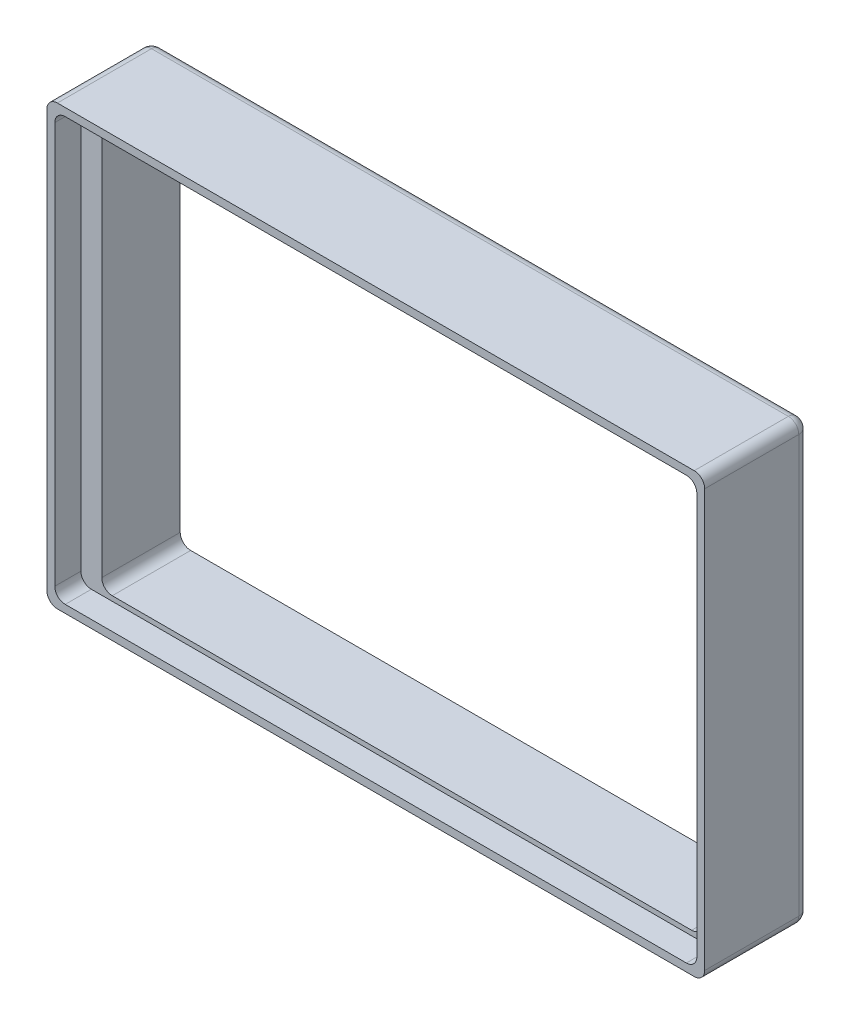
ISO-10303-21;
HEADER;
FILE_DESCRIPTION(('STEP AP214'),'2;1');
FILE_NAME('part.step','',(''),(''),'','','');
FILE_SCHEMA(('AUTOMOTIVE_DESIGN { 1 0 10303 214 1 1 1 1 }'));
ENDSEC;
DATA;
#1=APPLICATION_CONTEXT('core data for automotive mechanical design processes');
#2=APPLICATION_PROTOCOL_DEFINITION('international standard','automotive_design',2000,#1);
#3=PRODUCT_CONTEXT('',#1,'mechanical');
#4=PRODUCT('Part','Part','',(#3));
#5=PRODUCT_RELATED_PRODUCT_CATEGORY('part','',(#4));
#6=PRODUCT_DEFINITION_FORMATION('','',#4);
#7=PRODUCT_DEFINITION_CONTEXT('part definition',#1,'design');
#8=PRODUCT_DEFINITION('design','',#6,#7);
#9=PRODUCT_DEFINITION_SHAPE('','',#8);
#10=(LENGTH_UNIT() NAMED_UNIT(*) SI_UNIT(.MILLI.,.METRE.));
#11=(NAMED_UNIT(*) PLANE_ANGLE_UNIT() SI_UNIT($,.RADIAN.));
#12=(NAMED_UNIT(*) SI_UNIT($,.STERADIAN.) SOLID_ANGLE_UNIT());
#13=UNCERTAINTY_MEASURE_WITH_UNIT(LENGTH_MEASURE(1.E-05),#10,'distance_accuracy_value','');
#14=(GEOMETRIC_REPRESENTATION_CONTEXT(3) GLOBAL_UNCERTAINTY_ASSIGNED_CONTEXT((#13)) GLOBAL_UNIT_ASSIGNED_CONTEXT((#10,
#11,#12)) REPRESENTATION_CONTEXT('',''));
#15=CARTESIAN_POINT('',(0.,0.,0.));
#16=DIRECTION('',(0.,0.,1.));
#17=DIRECTION('',(1.,0.,0.));
#18=AXIS2_PLACEMENT_3D('',#15,#16,#17);
#19=CARTESIAN_POINT('',(0.,0.,15.));
#20=DIRECTION('',(0.,0.,1.));
#21=DIRECTION('',(1.,0.,0.));
#22=AXIS2_PLACEMENT_3D('',#19,#20,#21);
#23=PLANE('',#22);
#24=DIRECTION('',(-1.,0.,0.));
#25=VECTOR('',#24,1.);
#26=CARTESIAN_POINT('',(-61.405,40.4,15.));
#27=LINE('',#26,#25);
#28=CARTESIAN_POINT('',(59.405,40.4,15.));
#29=VERTEX_POINT('',#28);
#30=CARTESIAN_POINT('',(-59.405,40.4,15.));
#31=VERTEX_POINT('',#30);
#32=EDGE_CURVE('E445',#29,#31,#27,.T.);
#33=ORIENTED_EDGE('',*,*,#32,.T.);
#34=CARTESIAN_POINT('',(-59.405,38.4,15.));
#35=DIRECTION('',(0.,0.,1.));
#36=DIRECTION('',(1.,0.,0.));
#37=AXIS2_PLACEMENT_3D('',#34,#35,#36);
#38=CIRCLE('',#37,2.);
#39=CARTESIAN_POINT('',(-61.405,38.4,15.));
#40=VERTEX_POINT('',#39);
#41=EDGE_CURVE('E345',#31,#40,#38,.T.);
#42=ORIENTED_EDGE('',*,*,#41,.T.);
#43=DIRECTION('',(0.,-1.,0.));
#44=VECTOR('',#43,1.);
#45=CARTESIAN_POINT('',(-61.405,40.4,15.));
#46=LINE('',#45,#44);
#47=CARTESIAN_POINT('',(-61.405,-38.4,15.));
#48=VERTEX_POINT('',#47);
#49=EDGE_CURVE('E447',#40,#48,#46,.T.);
#50=ORIENTED_EDGE('',*,*,#49,.T.);
#51=CARTESIAN_POINT('',(-59.405,-38.4,15.));
#52=DIRECTION('',(0.,0.,1.));
#53=DIRECTION('',(1.,0.,0.));
#54=AXIS2_PLACEMENT_3D('',#51,#52,#53);
#55=CIRCLE('',#54,2.);
#56=CARTESIAN_POINT('',(-59.405,-40.4,15.));
#57=VERTEX_POINT('',#56);
#58=EDGE_CURVE('E336',#48,#57,#55,.T.);
#59=ORIENTED_EDGE('',*,*,#58,.T.);
#60=DIRECTION('',(1.,0.,0.));
#61=VECTOR('',#60,1.);
#62=CARTESIAN_POINT('',(-61.405,-40.4,15.));
#63=LINE('',#62,#61);
#64=CARTESIAN_POINT('',(59.405,-40.4,15.));
#65=VERTEX_POINT('',#64);
#66=EDGE_CURVE('E473',#57,#65,#63,.T.);
#67=ORIENTED_EDGE('',*,*,#66,.T.);
#68=CARTESIAN_POINT('',(59.405,-38.4,15.));
#69=DIRECTION('',(0.,0.,1.));
#70=DIRECTION('',(1.,0.,0.));
#71=AXIS2_PLACEMENT_3D('',#68,#69,#70);
#72=CIRCLE('',#71,2.);
#73=CARTESIAN_POINT('',(61.405,-38.4,15.));
#74=VERTEX_POINT('',#73);
#75=EDGE_CURVE('E339',#65,#74,#72,.T.);
#76=ORIENTED_EDGE('',*,*,#75,.T.);
#77=DIRECTION('',(0.,1.,0.));
#78=VECTOR('',#77,1.);
#79=CARTESIAN_POINT('',(61.405,40.4,15.));
#80=LINE('',#79,#78);
#81=CARTESIAN_POINT('',(61.405,38.4,15.));
#82=VERTEX_POINT('',#81);
#83=EDGE_CURVE('E448',#74,#82,#80,.T.);
#84=ORIENTED_EDGE('',*,*,#83,.T.);
#85=CARTESIAN_POINT('',(59.405,38.4,15.));
#86=DIRECTION('',(0.,0.,1.));
#87=DIRECTION('',(1.,0.,0.));
#88=AXIS2_PLACEMENT_3D('',#85,#86,#87);
#89=CIRCLE('',#88,2.);
#90=EDGE_CURVE('E342',#82,#29,#89,.T.);
#91=ORIENTED_EDGE('',*,*,#90,.T.);
#92=EDGE_LOOP('',(#33,#42,#50,#59,#67,#76,#84,#91));
#93=FACE_BOUND('',#92,.T.);
#94=DIRECTION('',(0.,-1.,0.));
#95=VECTOR('',#94,1.);
#96=CARTESIAN_POINT('',(57.41,39.47,15.));
#97=LINE('',#96,#95);
#98=CARTESIAN_POINT('',(57.41,37.47,15.));
#99=VERTEX_POINT('',#98);
#100=CARTESIAN_POINT('',(57.41,-37.47,15.));
#101=VERTEX_POINT('',#100);
#102=EDGE_CURVE('E443',#99,#101,#97,.T.);
#103=ORIENTED_EDGE('',*,*,#102,.T.);
#104=CARTESIAN_POINT('',(55.41,-37.47,15.));
#105=DIRECTION('',(0.,0.,1.));
#106=DIRECTION('',(1.,0.,0.));
#107=AXIS2_PLACEMENT_3D('',#104,#105,#106);
#108=CIRCLE('',#107,2.);
#109=CARTESIAN_POINT('',(55.41,-39.47,15.));
#110=VERTEX_POINT('',#109);
#111=EDGE_CURVE('E411',#101,#110,#108,.F.);
#112=ORIENTED_EDGE('',*,*,#111,.T.);
#113=DIRECTION('',(-1.,0.,0.));
#114=VECTOR('',#113,1.);
#115=CARTESIAN_POINT('',(57.41,-39.47,15.));
#116=LINE('',#115,#114);
#117=CARTESIAN_POINT('',(-55.41,-39.47,15.));
#118=VERTEX_POINT('',#117);
#119=EDGE_CURVE('E425',#110,#118,#116,.T.);
#120=ORIENTED_EDGE('',*,*,#119,.T.);
#121=CARTESIAN_POINT('',(-55.41,-37.47,15.));
#122=DIRECTION('',(0.,0.,1.));
#123=DIRECTION('',(1.,0.,0.));
#124=AXIS2_PLACEMENT_3D('',#121,#122,#123);
#125=CIRCLE('',#124,2.);
#126=CARTESIAN_POINT('',(-57.41,-37.47,15.));
#127=VERTEX_POINT('',#126);
#128=EDGE_CURVE('E11',#118,#127,#125,.F.);
#129=ORIENTED_EDGE('',*,*,#128,.T.);
#130=DIRECTION('',(0.,1.,0.));
#131=VECTOR('',#130,1.);
#132=CARTESIAN_POINT('',(-57.41,39.47,15.));
#133=LINE('',#132,#131);
#134=CARTESIAN_POINT('',(-57.41,37.47,15.));
#135=VERTEX_POINT('',#134);
#136=EDGE_CURVE('E459',#127,#135,#133,.T.);
#137=ORIENTED_EDGE('',*,*,#136,.T.);
#138=CARTESIAN_POINT('',(-55.41,37.47,15.));
#139=DIRECTION('',(0.,0.,1.));
#140=DIRECTION('',(1.,0.,0.));
#141=AXIS2_PLACEMENT_3D('',#138,#139,#140);
#142=CIRCLE('',#141,2.);
#143=CARTESIAN_POINT('',(-55.41,39.47,15.));
#144=VERTEX_POINT('',#143);
#145=EDGE_CURVE('E394',#135,#144,#142,.F.);
#146=ORIENTED_EDGE('',*,*,#145,.T.);
#147=DIRECTION('',(1.,0.,0.));
#148=VECTOR('',#147,1.);
#149=CARTESIAN_POINT('',(57.41,39.47,15.));
#150=LINE('',#149,#148);
#151=CARTESIAN_POINT('',(55.41,39.47,15.));
#152=VERTEX_POINT('',#151);
#153=EDGE_CURVE('E462',#144,#152,#150,.T.);
#154=ORIENTED_EDGE('',*,*,#153,.T.);
#155=CARTESIAN_POINT('',(55.41,37.47,15.));
#156=DIRECTION('',(0.,0.,1.));
#157=DIRECTION('',(1.,0.,0.));
#158=AXIS2_PLACEMENT_3D('',#155,#156,#157);
#159=CIRCLE('',#158,2.);
#160=EDGE_CURVE('E400',#152,#99,#159,.F.);
#161=ORIENTED_EDGE('',*,*,#160,.T.);
#162=EDGE_LOOP('',(#103,#112,#120,#129,#137,#146,#154,#161));
#163=FACE_BOUND('',#162,.T.);
#164=ADVANCED_FACE('F45',(#93,#163),#23,.T.);
#165=CARTESIAN_POINT('',(62.905,41.9,20.));
#166=DIRECTION('',(-1.,0.,0.));
#167=DIRECTION('',(0.,0.,1.));
#168=AXIS2_PLACEMENT_3D('',#165,#166,#167);
#169=PLANE('',#168);
#170=DIRECTION('',(0.,1.,0.));
#171=VECTOR('',#170,1.);
#172=CARTESIAN_POINT('',(62.905,41.9,2.));
#173=LINE('',#172,#171);
#174=CARTESIAN_POINT('',(62.905,-39.9,2.));
#175=VERTEX_POINT('',#174);
#176=CARTESIAN_POINT('',(62.905,39.9,2.));
#177=VERTEX_POINT('',#176);
#178=EDGE_CURVE('E235',#175,#177,#173,.T.);
#179=ORIENTED_EDGE('',*,*,#178,.T.);
#180=DIRECTION('',(0.,0.,-1.));
#181=VECTOR('',#180,1.);
#182=CARTESIAN_POINT('',(62.905,39.9,20.));
#183=LINE('',#182,#181);
#184=CARTESIAN_POINT('',(62.905,39.9,20.));
#185=VERTEX_POINT('',#184);
#186=EDGE_CURVE('E282',#177,#185,#183,.F.);
#187=ORIENTED_EDGE('',*,*,#186,.T.);
#188=DIRECTION('',(0.,1.,0.));
#189=VECTOR('',#188,1.);
#190=CARTESIAN_POINT('',(62.905,41.9,20.));
#191=LINE('',#190,#189);
#192=CARTESIAN_POINT('',(62.905,-39.9,20.));
#193=VERTEX_POINT('',#192);
#194=EDGE_CURVE('E439',#193,#185,#191,.T.);
#195=ORIENTED_EDGE('',*,*,#194,.F.);
#196=DIRECTION('',(0.,0.,-1.));
#197=VECTOR('',#196,1.);
#198=CARTESIAN_POINT('',(62.905,-39.9,20.));
#199=LINE('',#198,#197);
#200=EDGE_CURVE('E279',#193,#175,#199,.T.);
#201=ORIENTED_EDGE('',*,*,#200,.T.);
#202=EDGE_LOOP('',(#179,#187,#195,#201));
#203=FACE_BOUND('',#202,.T.);
#204=ADVANCED_FACE('F584',(#203),#169,.F.);
#205=CARTESIAN_POINT('',(-62.905,41.9,20.));
#206=DIRECTION('',(0.,-1.,0.));
#207=DIRECTION('',(0.,0.,-1.));
#208=AXIS2_PLACEMENT_3D('',#205,#206,#207);
#209=PLANE('',#208);
#210=DIRECTION('',(-1.,0.,0.));
#211=VECTOR('',#210,1.);
#212=CARTESIAN_POINT('',(-62.905,41.9,20.));
#213=LINE('',#212,#211);
#214=CARTESIAN_POINT('',(60.905,41.9,20.));
#215=VERTEX_POINT('',#214);
#216=CARTESIAN_POINT('',(-60.905,41.9,20.));
#217=VERTEX_POINT('',#216);
#218=EDGE_CURVE('E435',#215,#217,#213,.T.);
#219=ORIENTED_EDGE('',*,*,#218,.F.);
#220=DIRECTION('',(0.,0.,-1.));
#221=VECTOR('',#220,1.);
#222=CARTESIAN_POINT('',(60.905,41.9,20.));
#223=LINE('',#222,#221);
#224=CARTESIAN_POINT('',(60.905,41.9,2.));
#225=VERTEX_POINT('',#224);
#226=EDGE_CURVE('E276',#215,#225,#223,.T.);
#227=ORIENTED_EDGE('',*,*,#226,.T.);
#228=DIRECTION('',(-1.,0.,0.));
#229=VECTOR('',#228,1.);
#230=CARTESIAN_POINT('',(-62.905,41.9,2.));
#231=LINE('',#230,#229);
#232=CARTESIAN_POINT('',(-60.905,41.9,2.));
#233=VERTEX_POINT('',#232);
#234=EDGE_CURVE('E228',#225,#233,#231,.T.);
#235=ORIENTED_EDGE('',*,*,#234,.T.);
#236=DIRECTION('',(0.,0.,-1.));
#237=VECTOR('',#236,1.);
#238=CARTESIAN_POINT('',(-60.905,41.9,20.));
#239=LINE('',#238,#237);
#240=EDGE_CURVE('E267',#233,#217,#239,.F.);
#241=ORIENTED_EDGE('',*,*,#240,.T.);
#242=EDGE_LOOP('',(#219,#227,#235,#241));
#243=FACE_BOUND('',#242,.T.);
#244=ADVANCED_FACE('F522',(#243),#209,.F.);
#245=CARTESIAN_POINT('',(-62.905,41.9,20.));
#246=DIRECTION('',(1.,0.,0.));
#247=DIRECTION('',(0.,0.,-1.));
#248=AXIS2_PLACEMENT_3D('',#245,#246,#247);
#249=PLANE('',#248);
#250=DIRECTION('',(0.,-1.,0.));
#251=VECTOR('',#250,1.);
#252=CARTESIAN_POINT('',(-62.905,41.9,20.));
#253=LINE('',#252,#251);
#254=CARTESIAN_POINT('',(-62.905,39.9,20.));
#255=VERTEX_POINT('',#254);
#256=CARTESIAN_POINT('',(-62.905,-39.9,20.));
#257=VERTEX_POINT('',#256);
#258=EDGE_CURVE('E431',#255,#257,#253,.T.);
#259=ORIENTED_EDGE('',*,*,#258,.F.);
#260=DIRECTION('',(0.,0.,-1.));
#261=VECTOR('',#260,1.);
#262=CARTESIAN_POINT('',(-62.905,39.9,20.));
#263=LINE('',#262,#261);
#264=CARTESIAN_POINT('',(-62.905,39.9,2.));
#265=VERTEX_POINT('',#264);
#266=EDGE_CURVE('E300',#255,#265,#263,.T.);
#267=ORIENTED_EDGE('',*,*,#266,.T.);
#268=DIRECTION('',(0.,-1.,0.));
#269=VECTOR('',#268,1.);
#270=CARTESIAN_POINT('',(-62.905,41.9,2.));
#271=LINE('',#270,#269);
#272=CARTESIAN_POINT('',(-62.905,-39.9,2.));
#273=VERTEX_POINT('',#272);
#274=EDGE_CURVE('E258',#265,#273,#271,.T.);
#275=ORIENTED_EDGE('',*,*,#274,.T.);
#276=DIRECTION('',(0.,0.,-1.));
#277=VECTOR('',#276,1.);
#278=CARTESIAN_POINT('',(-62.905,-39.9,20.));
#279=LINE('',#278,#277);
#280=EDGE_CURVE('E297',#273,#257,#279,.F.);
#281=ORIENTED_EDGE('',*,*,#280,.T.);
#282=EDGE_LOOP('',(#259,#267,#275,#281));
#283=FACE_BOUND('',#282,.T.);
#284=ADVANCED_FACE('F510',(#283),#249,.F.);
#285=CARTESIAN_POINT('',(-62.905,-41.9,20.));
#286=DIRECTION('',(0.,1.,0.));
#287=DIRECTION('',(0.,0.,1.));
#288=AXIS2_PLACEMENT_3D('',#285,#286,#287);
#289=PLANE('',#288);
#290=DIRECTION('',(1.,0.,0.));
#291=VECTOR('',#290,1.);
#292=CARTESIAN_POINT('',(-62.905,-41.9,20.));
#293=LINE('',#292,#291);
#294=CARTESIAN_POINT('',(-60.905,-41.9,20.));
#295=VERTEX_POINT('',#294);
#296=CARTESIAN_POINT('',(60.905,-41.9,20.));
#297=VERTEX_POINT('',#296);
#298=EDGE_CURVE('E434',#295,#297,#293,.T.);
#299=ORIENTED_EDGE('',*,*,#298,.F.);
#300=DIRECTION('',(0.,0.,-1.));
#301=VECTOR('',#300,1.);
#302=CARTESIAN_POINT('',(-60.905,-41.9,20.));
#303=LINE('',#302,#301);
#304=CARTESIAN_POINT('',(-60.905,-41.9,2.));
#305=VERTEX_POINT('',#304);
#306=EDGE_CURVE('E306',#295,#305,#303,.T.);
#307=ORIENTED_EDGE('',*,*,#306,.T.);
#308=DIRECTION('',(1.,0.,0.));
#309=VECTOR('',#308,1.);
#310=CARTESIAN_POINT('',(-62.905,-41.9,2.));
#311=LINE('',#310,#309);
#312=CARTESIAN_POINT('',(60.905,-41.9,2.));
#313=VERTEX_POINT('',#312);
#314=EDGE_CURVE('E485',#305,#313,#311,.T.);
#315=ORIENTED_EDGE('',*,*,#314,.T.);
#316=DIRECTION('',(0.,0.,-1.));
#317=VECTOR('',#316,1.);
#318=CARTESIAN_POINT('',(60.905,-41.9,20.));
#319=LINE('',#318,#317);
#320=EDGE_CURVE('E303',#313,#297,#319,.F.);
#321=ORIENTED_EDGE('',*,*,#320,.T.);
#322=EDGE_LOOP('',(#299,#307,#315,#321));
#323=FACE_BOUND('',#322,.T.);
#324=ADVANCED_FACE('F612',(#323),#289,.F.);
#325=CARTESIAN_POINT('',(0.,0.,20.));
#326=DIRECTION('',(0.,0.,1.));
#327=DIRECTION('',(1.,0.,0.));
#328=AXIS2_PLACEMENT_3D('',#325,#326,#327);
#329=PLANE('',#328);
#330=DIRECTION('',(0.,1.,0.));
#331=VECTOR('',#330,1.);
#332=CARTESIAN_POINT('',(61.405,40.4,20.));
#333=LINE('',#332,#331);
#334=CARTESIAN_POINT('',(61.405,-38.4,20.));
#335=VERTEX_POINT('',#334);
#336=CARTESIAN_POINT('',(61.405,38.4,20.));
#337=VERTEX_POINT('',#336);
#338=EDGE_CURVE('E422',#335,#337,#333,.T.);
#339=ORIENTED_EDGE('',*,*,#338,.F.);
#340=CARTESIAN_POINT('',(59.405,-38.4,20.));
#341=DIRECTION('',(0.,0.,1.));
#342=DIRECTION('',(1.,0.,0.));
#343=AXIS2_PLACEMENT_3D('',#340,#341,#342);
#344=CIRCLE('',#343,2.);
#345=CARTESIAN_POINT('',(59.405,-40.4,20.));
#346=VERTEX_POINT('',#345);
#347=EDGE_CURVE('E406',#335,#346,#344,.F.);
#348=ORIENTED_EDGE('',*,*,#347,.T.);
#349=DIRECTION('',(1.,0.,0.));
#350=VECTOR('',#349,1.);
#351=CARTESIAN_POINT('',(-61.405,-40.4,20.));
#352=LINE('',#351,#350);
#353=CARTESIAN_POINT('',(-59.405,-40.4,20.));
#354=VERTEX_POINT('',#353);
#355=EDGE_CURVE('E468',#354,#346,#352,.T.);
#356=ORIENTED_EDGE('',*,*,#355,.F.);
#357=CARTESIAN_POINT('',(-59.405,-38.4,20.));
#358=DIRECTION('',(0.,0.,1.));
#359=DIRECTION('',(1.,0.,0.));
#360=AXIS2_PLACEMENT_3D('',#357,#358,#359);
#361=CIRCLE('',#360,2.);
#362=CARTESIAN_POINT('',(-61.405,-38.4,20.));
#363=VERTEX_POINT('',#362);
#364=EDGE_CURVE('E414',#354,#363,#361,.F.);
#365=ORIENTED_EDGE('',*,*,#364,.T.);
#366=DIRECTION('',(0.,-1.,0.));
#367=VECTOR('',#366,1.);
#368=CARTESIAN_POINT('',(-61.405,40.4,20.));
#369=LINE('',#368,#367);
#370=CARTESIAN_POINT('',(-61.405,38.4,20.));
#371=VERTEX_POINT('',#370);
#372=EDGE_CURVE('E465',#371,#363,#369,.T.);
#373=ORIENTED_EDGE('',*,*,#372,.F.);
#374=CARTESIAN_POINT('',(-59.405,38.4,20.));
#375=DIRECTION('',(0.,0.,1.));
#376=DIRECTION('',(1.,0.,0.));
#377=AXIS2_PLACEMENT_3D('',#374,#375,#376);
#378=CIRCLE('',#377,2.);
#379=CARTESIAN_POINT('',(-59.405,40.4,20.));
#380=VERTEX_POINT('',#379);
#381=EDGE_CURVE('E388',#371,#380,#378,.F.);
#382=ORIENTED_EDGE('',*,*,#381,.T.);
#383=DIRECTION('',(-1.,0.,0.));
#384=VECTOR('',#383,1.);
#385=CARTESIAN_POINT('',(-61.405,40.4,20.));
#386=LINE('',#385,#384);
#387=CARTESIAN_POINT('',(59.405,40.4,20.));
#388=VERTEX_POINT('',#387);
#389=EDGE_CURVE('E424',#388,#380,#386,.T.);
#390=ORIENTED_EDGE('',*,*,#389,.F.);
#391=CARTESIAN_POINT('',(59.405,38.4,20.));
#392=DIRECTION('',(0.,0.,1.));
#393=DIRECTION('',(1.,0.,0.));
#394=AXIS2_PLACEMENT_3D('',#391,#392,#393);
#395=CIRCLE('',#394,2.);
#396=EDGE_CURVE('E403',#388,#337,#395,.F.);
#397=ORIENTED_EDGE('',*,*,#396,.T.);
#398=EDGE_LOOP('',(#339,#348,#356,#365,#373,#382,#390,#397));
#399=FACE_BOUND('',#398,.T.);
#400=ORIENTED_EDGE('',*,*,#194,.T.);
#401=CARTESIAN_POINT('',(60.905,39.9,20.));
#402=DIRECTION('',(0.,0.,1.));
#403=DIRECTION('',(1.,0.,0.));
#404=AXIS2_PLACEMENT_3D('',#401,#402,#403);
#405=CIRCLE('',#404,2.);
#406=EDGE_CURVE('E294',#185,#215,#405,.T.);
#407=ORIENTED_EDGE('',*,*,#406,.T.);
#408=ORIENTED_EDGE('',*,*,#218,.T.);
#409=CARTESIAN_POINT('',(-60.905,39.9,20.));
#410=DIRECTION('',(0.,0.,1.));
#411=DIRECTION('',(1.,0.,0.));
#412=AXIS2_PLACEMENT_3D('',#409,#410,#411);
#413=CIRCLE('',#412,2.);
#414=EDGE_CURVE('E291',#217,#255,#413,.T.);
#415=ORIENTED_EDGE('',*,*,#414,.T.);
#416=ORIENTED_EDGE('',*,*,#258,.T.);
#417=CARTESIAN_POINT('',(-60.905,-39.9,20.));
#418=DIRECTION('',(0.,0.,1.));
#419=DIRECTION('',(1.,0.,0.));
#420=AXIS2_PLACEMENT_3D('',#417,#418,#419);
#421=CIRCLE('',#420,2.);
#422=EDGE_CURVE('E288',#257,#295,#421,.T.);
#423=ORIENTED_EDGE('',*,*,#422,.T.);
#424=ORIENTED_EDGE('',*,*,#298,.T.);
#425=CARTESIAN_POINT('',(60.905,-39.9,20.));
#426=DIRECTION('',(0.,0.,1.));
#427=DIRECTION('',(1.,0.,0.));
#428=AXIS2_PLACEMENT_3D('',#425,#426,#427);
#429=CIRCLE('',#428,2.);
#430=EDGE_CURVE('E285',#297,#193,#429,.T.);
#431=ORIENTED_EDGE('',*,*,#430,.T.);
#432=EDGE_LOOP('',(#400,#407,#408,#415,#416,#423,#424,#431));
#433=FACE_BOUND('',#432,.T.);
#434=ADVANCED_FACE('F609',(#399,#433),#329,.T.);
#435=CARTESIAN_POINT('',(0.,0.,0.));
#436=DIRECTION('',(0.,0.,1.));
#437=DIRECTION('',(1.,0.,0.));
#438=AXIS2_PLACEMENT_3D('',#435,#436,#437);
#439=PLANE('',#438);
#440=DIRECTION('',(0.,-1.,0.));
#441=VECTOR('',#440,1.);
#442=CARTESIAN_POINT('',(-60.905,0.,0.));
#443=LINE('',#442,#441);
#444=CARTESIAN_POINT('',(-60.905,-39.9,0.));
#445=VERTEX_POINT('',#444);
#446=CARTESIAN_POINT('',(-60.905,39.9,0.));
#447=VERTEX_POINT('',#446);
#448=EDGE_CURVE('E256',#445,#447,#443,.F.);
#449=ORIENTED_EDGE('',*,*,#448,.T.);
#450=DIRECTION('',(-1.,0.,0.));
#451=VECTOR('',#450,1.);
#452=CARTESIAN_POINT('',(0.,39.9,0.));
#453=LINE('',#452,#451);
#454=CARTESIAN_POINT('',(60.905,39.9,0.));
#455=VERTEX_POINT('',#454);
#456=EDGE_CURVE('E225',#447,#455,#453,.F.);
#457=ORIENTED_EDGE('',*,*,#456,.T.);
#458=DIRECTION('',(0.,1.,0.));
#459=VECTOR('',#458,1.);
#460=CARTESIAN_POINT('',(60.905,0.,0.));
#461=LINE('',#460,#459);
#462=CARTESIAN_POINT('',(60.905,-39.9,0.));
#463=VERTEX_POINT('',#462);
#464=EDGE_CURVE('E240',#455,#463,#461,.F.);
#465=ORIENTED_EDGE('',*,*,#464,.T.);
#466=DIRECTION('',(1.,0.,0.));
#467=VECTOR('',#466,1.);
#468=CARTESIAN_POINT('',(0.,-39.9,0.));
#469=LINE('',#468,#467);
#470=EDGE_CURVE('E251',#463,#445,#469,.F.);
#471=ORIENTED_EDGE('',*,*,#470,.T.);
#472=EDGE_LOOP('',(#449,#457,#465,#471));
#473=FACE_BOUND('',#472,.T.);
#474=DIRECTION('',(1.,0.,0.));
#475=VECTOR('',#474,1.);
#476=CARTESIAN_POINT('',(57.41,39.47,0.));
#477=LINE('',#476,#475);
#478=CARTESIAN_POINT('',(-55.41,39.47,0.));
#479=VERTEX_POINT('',#478);
#480=CARTESIAN_POINT('',(55.41,39.47,0.));
#481=VERTEX_POINT('',#480);
#482=EDGE_CURVE('E451',#479,#481,#477,.T.);
#483=ORIENTED_EDGE('',*,*,#482,.F.);
#484=CARTESIAN_POINT('',(-55.41,37.47,0.));
#485=DIRECTION('',(0.,0.,1.));
#486=DIRECTION('',(1.,0.,0.));
#487=AXIS2_PLACEMENT_3D('',#484,#485,#486);
#488=CIRCLE('',#487,2.);
#489=CARTESIAN_POINT('',(-57.41,37.47,0.));
#490=VERTEX_POINT('',#489);
#491=EDGE_CURVE('E391',#479,#490,#488,.T.);
#492=ORIENTED_EDGE('',*,*,#491,.T.);
#493=DIRECTION('',(0.,1.,0.));
#494=VECTOR('',#493,1.);
#495=CARTESIAN_POINT('',(-57.41,39.47,0.));
#496=LINE('',#495,#494);
#497=CARTESIAN_POINT('',(-57.41,-37.47,0.));
#498=VERTEX_POINT('',#497);
#499=EDGE_CURVE('E313',#498,#490,#496,.T.);
#500=ORIENTED_EDGE('',*,*,#499,.F.);
#501=CARTESIAN_POINT('',(-55.41,-37.47,0.));
#502=DIRECTION('',(0.,0.,1.));
#503=DIRECTION('',(1.,0.,0.));
#504=AXIS2_PLACEMENT_3D('',#501,#502,#503);
#505=CIRCLE('',#504,2.);
#506=CARTESIAN_POINT('',(-55.41,-39.47,0.));
#507=VERTEX_POINT('',#506);
#508=EDGE_CURVE('E54',#498,#507,#505,.T.);
#509=ORIENTED_EDGE('',*,*,#508,.T.);
#510=DIRECTION('',(-1.,0.,0.));
#511=VECTOR('',#510,1.);
#512=CARTESIAN_POINT('',(57.41,-39.47,0.));
#513=LINE('',#512,#511);
#514=CARTESIAN_POINT('',(55.41,-39.47,0.));
#515=VERTEX_POINT('',#514);
#516=EDGE_CURVE('E463',#515,#507,#513,.T.);
#517=ORIENTED_EDGE('',*,*,#516,.F.);
#518=CARTESIAN_POINT('',(55.41,-37.47,0.));
#519=DIRECTION('',(0.,0.,1.));
#520=DIRECTION('',(1.,0.,0.));
#521=AXIS2_PLACEMENT_3D('',#518,#519,#520);
#522=CIRCLE('',#521,2.);
#523=CARTESIAN_POINT('',(57.41,-37.47,0.));
#524=VERTEX_POINT('',#523);
#525=EDGE_CURVE('E68',#515,#524,#522,.T.);
#526=ORIENTED_EDGE('',*,*,#525,.T.);
#527=DIRECTION('',(0.,-1.,0.));
#528=VECTOR('',#527,1.);
#529=CARTESIAN_POINT('',(57.41,39.47,0.));
#530=LINE('',#529,#528);
#531=CARTESIAN_POINT('',(57.41,37.47,0.));
#532=VERTEX_POINT('',#531);
#533=EDGE_CURVE('E453',#532,#524,#530,.T.);
#534=ORIENTED_EDGE('',*,*,#533,.F.);
#535=CARTESIAN_POINT('',(55.41,37.47,0.));
#536=DIRECTION('',(0.,0.,1.));
#537=DIRECTION('',(1.,0.,0.));
#538=AXIS2_PLACEMENT_3D('',#535,#536,#537);
#539=CIRCLE('',#538,2.);
#540=EDGE_CURVE('E397',#532,#481,#539,.T.);
#541=ORIENTED_EDGE('',*,*,#540,.T.);
#542=EDGE_LOOP('',(#483,#492,#500,#509,#517,#526,#534,#541));
#543=FACE_BOUND('',#542,.T.);
#544=ADVANCED_FACE('F254',(#473,#543),#439,.F.);
#545=CARTESIAN_POINT('',(61.405,40.4,15.));
#546=DIRECTION('',(1.,0.,0.));
#547=DIRECTION('',(0.,0.,-1.));
#548=AXIS2_PLACEMENT_3D('',#545,#546,#547);
#549=PLANE('',#548);
#550=ORIENTED_EDGE('',*,*,#338,.T.);
#551=DIRECTION('',(0.,0.,1.));
#552=VECTOR('',#551,1.);
#553=CARTESIAN_POINT('',(61.405,38.4,15.));
#554=LINE('',#553,#552);
#555=EDGE_CURVE('E372',#337,#82,#554,.F.);
#556=ORIENTED_EDGE('',*,*,#555,.T.);
#557=ORIENTED_EDGE('',*,*,#83,.F.);
#558=DIRECTION('',(0.,0.,1.));
#559=VECTOR('',#558,1.);
#560=CARTESIAN_POINT('',(61.405,-38.4,20.));
#561=LINE('',#560,#559);
#562=EDGE_CURVE('E368',#74,#335,#561,.T.);
#563=ORIENTED_EDGE('',*,*,#562,.T.);
#564=EDGE_LOOP('',(#550,#556,#557,#563));
#565=FACE_BOUND('',#564,.T.);
#566=ADVANCED_FACE('F597',(#565),#549,.F.);
#567=CARTESIAN_POINT('',(-61.405,-40.4,15.));
#568=DIRECTION('',(0.,-1.,0.));
#569=DIRECTION('',(0.,0.,-1.));
#570=AXIS2_PLACEMENT_3D('',#567,#568,#569);
#571=PLANE('',#570);
#572=ORIENTED_EDGE('',*,*,#355,.T.);
#573=DIRECTION('',(0.,0.,1.));
#574=VECTOR('',#573,1.);
#575=CARTESIAN_POINT('',(59.405,-40.4,15.));
#576=LINE('',#575,#574);
#577=EDGE_CURVE('E379',#346,#65,#576,.F.);
#578=ORIENTED_EDGE('',*,*,#577,.T.);
#579=ORIENTED_EDGE('',*,*,#66,.F.);
#580=DIRECTION('',(0.,0.,1.));
#581=VECTOR('',#580,1.);
#582=CARTESIAN_POINT('',(-59.405,-40.4,20.));
#583=LINE('',#582,#581);
#584=EDGE_CURVE('E375',#57,#354,#583,.T.);
#585=ORIENTED_EDGE('',*,*,#584,.T.);
#586=EDGE_LOOP('',(#572,#578,#579,#585));
#587=FACE_BOUND('',#586,.T.);
#588=ADVANCED_FACE('F593',(#587),#571,.F.);
#589=CARTESIAN_POINT('',(-61.405,40.4,15.));
#590=DIRECTION('',(-1.,0.,0.));
#591=DIRECTION('',(0.,0.,1.));
#592=AXIS2_PLACEMENT_3D('',#589,#590,#591);
#593=PLANE('',#592);
#594=ORIENTED_EDGE('',*,*,#49,.F.);
#595=DIRECTION('',(0.,0.,1.));
#596=VECTOR('',#595,1.);
#597=CARTESIAN_POINT('',(-61.405,38.4,20.));
#598=LINE('',#597,#596);
#599=EDGE_CURVE('E325',#40,#371,#598,.T.);
#600=ORIENTED_EDGE('',*,*,#599,.T.);
#601=ORIENTED_EDGE('',*,*,#372,.T.);
#602=DIRECTION('',(0.,0.,1.));
#603=VECTOR('',#602,1.);
#604=CARTESIAN_POINT('',(-61.405,-38.4,15.));
#605=LINE('',#604,#603);
#606=EDGE_CURVE('E309',#363,#48,#605,.F.);
#607=ORIENTED_EDGE('',*,*,#606,.T.);
#608=EDGE_LOOP('',(#594,#600,#601,#607));
#609=FACE_BOUND('',#608,.T.);
#610=ADVANCED_FACE('F596',(#609),#593,.F.);
#611=CARTESIAN_POINT('',(-61.405,40.4,15.));
#612=DIRECTION('',(0.,1.,0.));
#613=DIRECTION('',(0.,0.,1.));
#614=AXIS2_PLACEMENT_3D('',#611,#612,#613);
#615=PLANE('',#614);
#616=ORIENTED_EDGE('',*,*,#389,.T.);
#617=DIRECTION('',(0.,0.,1.));
#618=VECTOR('',#617,1.);
#619=CARTESIAN_POINT('',(-59.405,40.4,15.));
#620=LINE('',#619,#618);
#621=EDGE_CURVE('E333',#380,#31,#620,.F.);
#622=ORIENTED_EDGE('',*,*,#621,.T.);
#623=ORIENTED_EDGE('',*,*,#32,.F.);
#624=DIRECTION('',(0.,0.,1.));
#625=VECTOR('',#624,1.);
#626=CARTESIAN_POINT('',(59.405,40.4,20.));
#627=LINE('',#626,#625);
#628=EDGE_CURVE('E329',#29,#388,#627,.T.);
#629=ORIENTED_EDGE('',*,*,#628,.T.);
#630=EDGE_LOOP('',(#616,#622,#623,#629));
#631=FACE_BOUND('',#630,.T.);
#632=ADVANCED_FACE('F601',(#631),#615,.F.);
#633=CARTESIAN_POINT('',(-57.41,39.47,15.));
#634=DIRECTION('',(-1.,0.,0.));
#635=DIRECTION('',(0.,0.,1.));
#636=AXIS2_PLACEMENT_3D('',#633,#634,#635);
#637=PLANE('',#636);
#638=ORIENTED_EDGE('',*,*,#499,.T.);
#639=DIRECTION('',(0.,0.,-1.));
#640=VECTOR('',#639,1.);
#641=CARTESIAN_POINT('',(-57.41,37.47,15.));
#642=LINE('',#641,#640);
#643=EDGE_CURVE('E359',#490,#135,#642,.F.);
#644=ORIENTED_EDGE('',*,*,#643,.T.);
#645=ORIENTED_EDGE('',*,*,#136,.F.);
#646=DIRECTION('',(0.,0.,-1.));
#647=VECTOR('',#646,1.);
#648=CARTESIAN_POINT('',(-57.41,-37.47,0.));
#649=LINE('',#648,#647);
#650=EDGE_CURVE('E355',#127,#498,#649,.T.);
#651=ORIENTED_EDGE('',*,*,#650,.T.);
#652=EDGE_LOOP('',(#638,#644,#645,#651));
#653=FACE_BOUND('',#652,.T.);
#654=ADVANCED_FACE('F567',(#653),#637,.F.);
#655=CARTESIAN_POINT('',(57.41,-39.47,15.));
#656=DIRECTION('',(0.,-1.,0.));
#657=DIRECTION('',(0.,0.,-1.));
#658=AXIS2_PLACEMENT_3D('',#655,#656,#657);
#659=PLANE('',#658);
#660=ORIENTED_EDGE('',*,*,#119,.F.);
#661=DIRECTION('',(0.,0.,-1.));
#662=VECTOR('',#661,1.);
#663=CARTESIAN_POINT('',(55.41,-39.47,0.));
#664=LINE('',#663,#662);
#665=EDGE_CURVE('E385',#110,#515,#664,.T.);
#666=ORIENTED_EDGE('',*,*,#665,.T.);
#667=ORIENTED_EDGE('',*,*,#516,.T.);
#668=DIRECTION('',(0.,0.,-1.));
#669=VECTOR('',#668,1.);
#670=CARTESIAN_POINT('',(-55.41,-39.47,15.));
#671=LINE('',#670,#669);
#672=EDGE_CURVE('E382',#507,#118,#671,.F.);
#673=ORIENTED_EDGE('',*,*,#672,.T.);
#674=EDGE_LOOP('',(#660,#666,#667,#673));
#675=FACE_BOUND('',#674,.T.);
#676=ADVANCED_FACE('F561',(#675),#659,.F.);
#677=CARTESIAN_POINT('',(57.41,39.47,15.));
#678=DIRECTION('',(1.,0.,0.));
#679=DIRECTION('',(0.,0.,-1.));
#680=AXIS2_PLACEMENT_3D('',#677,#678,#679);
#681=PLANE('',#680);
#682=ORIENTED_EDGE('',*,*,#102,.F.);
#683=DIRECTION('',(0.,0.,-1.));
#684=VECTOR('',#683,1.);
#685=CARTESIAN_POINT('',(57.41,37.47,0.));
#686=LINE('',#685,#684);
#687=EDGE_CURVE('E364',#99,#532,#686,.T.);
#688=ORIENTED_EDGE('',*,*,#687,.T.);
#689=ORIENTED_EDGE('',*,*,#533,.T.);
#690=DIRECTION('',(0.,0.,-1.));
#691=VECTOR('',#690,1.);
#692=CARTESIAN_POINT('',(57.41,-37.47,15.));
#693=LINE('',#692,#691);
#694=EDGE_CURVE('E361',#524,#101,#693,.F.);
#695=ORIENTED_EDGE('',*,*,#694,.T.);
#696=EDGE_LOOP('',(#682,#688,#689,#695));
#697=FACE_BOUND('',#696,.T.);
#698=ADVANCED_FACE('F556',(#697),#681,.F.);
#699=CARTESIAN_POINT('',(57.41,39.47,15.));
#700=DIRECTION('',(0.,1.,0.));
#701=DIRECTION('',(0.,0.,1.));
#702=AXIS2_PLACEMENT_3D('',#699,#700,#701);
#703=PLANE('',#702);
#704=ORIENTED_EDGE('',*,*,#153,.F.);
#705=DIRECTION('',(0.,0.,-1.));
#706=VECTOR('',#705,1.);
#707=CARTESIAN_POINT('',(-55.41,39.47,0.));
#708=LINE('',#707,#706);
#709=EDGE_CURVE('E351',#144,#479,#708,.T.);
#710=ORIENTED_EDGE('',*,*,#709,.T.);
#711=ORIENTED_EDGE('',*,*,#482,.T.);
#712=DIRECTION('',(0.,0.,-1.));
#713=VECTOR('',#712,1.);
#714=CARTESIAN_POINT('',(55.41,39.47,15.));
#715=LINE('',#714,#713);
#716=EDGE_CURVE('E348',#481,#152,#715,.F.);
#717=ORIENTED_EDGE('',*,*,#716,.T.);
#718=EDGE_LOOP('',(#704,#710,#711,#717));
#719=FACE_BOUND('',#718,.T.);
#720=ADVANCED_FACE('F571',(#719),#703,.F.);
#721=CARTESIAN_POINT('',(-62.905,-39.9,2.));
#722=DIRECTION('',(1.,0.,0.));
#723=DIRECTION('',(0.,0.,-1.));
#724=AXIS2_PLACEMENT_3D('',#721,#722,#723);
#725=CYLINDRICAL_SURFACE('',#724,2.);
#726=ORIENTED_EDGE('',*,*,#314,.F.);
#727=CARTESIAN_POINT('',(-60.905,-39.9,2.));
#728=DIRECTION('',(1.,0.,0.));
#729=DIRECTION('',(0.,0.,-1.));
#730=AXIS2_PLACEMENT_3D('',#727,#728,#729);
#731=CIRCLE('',#730,2.);
#732=EDGE_CURVE('E263',#305,#445,#731,.T.);
#733=ORIENTED_EDGE('',*,*,#732,.T.);
#734=ORIENTED_EDGE('',*,*,#470,.F.);
#735=CARTESIAN_POINT('',(60.905,-39.9,2.));
#736=DIRECTION('',(1.,0.,0.));
#737=DIRECTION('',(0.,0.,-1.));
#738=AXIS2_PLACEMENT_3D('',#735,#736,#737);
#739=CIRCLE('',#738,2.);
#740=EDGE_CURVE('E270',#463,#313,#739,.F.);
#741=ORIENTED_EDGE('',*,*,#740,.T.);
#742=EDGE_LOOP('',(#726,#733,#734,#741));
#743=FACE_BOUND('',#742,.T.);
#744=ADVANCED_FACE('F573',(#743),#725,.T.);
#745=CARTESIAN_POINT('',(60.905,41.9,2.));
#746=DIRECTION('',(0.,1.,0.));
#747=DIRECTION('',(0.,0.,1.));
#748=AXIS2_PLACEMENT_3D('',#745,#746,#747);
#749=CYLINDRICAL_SURFACE('',#748,2.);
#750=ORIENTED_EDGE('',*,*,#178,.F.);
#751=CARTESIAN_POINT('',(60.905,-39.9,2.));
#752=DIRECTION('',(0.,1.,0.));
#753=DIRECTION('',(0.,0.,1.));
#754=AXIS2_PLACEMENT_3D('',#751,#752,#753);
#755=CIRCLE('',#754,2.);
#756=EDGE_CURVE('E246',#175,#463,#755,.T.);
#757=ORIENTED_EDGE('',*,*,#756,.T.);
#758=ORIENTED_EDGE('',*,*,#464,.F.);
#759=CARTESIAN_POINT('',(60.905,39.9,2.));
#760=DIRECTION('',(0.,1.,0.));
#761=DIRECTION('',(0.,0.,1.));
#762=AXIS2_PLACEMENT_3D('',#759,#760,#761);
#763=CIRCLE('',#762,2.);
#764=EDGE_CURVE('E243',#455,#177,#763,.F.);
#765=ORIENTED_EDGE('',*,*,#764,.T.);
#766=EDGE_LOOP('',(#750,#757,#758,#765));
#767=FACE_BOUND('',#766,.T.);
#768=ADVANCED_FACE('F242',(#767),#749,.T.);
#769=CARTESIAN_POINT('',(-60.905,41.9,2.));
#770=DIRECTION('',(0.,-1.,0.));
#771=DIRECTION('',(0.,0.,-1.));
#772=AXIS2_PLACEMENT_3D('',#769,#770,#771);
#773=CYLINDRICAL_SURFACE('',#772,2.);
#774=ORIENTED_EDGE('',*,*,#274,.F.);
#775=CARTESIAN_POINT('',(-60.905,39.9,2.));
#776=DIRECTION('',(0.,-1.,0.));
#777=DIRECTION('',(0.,0.,-1.));
#778=AXIS2_PLACEMENT_3D('',#775,#776,#777);
#779=CIRCLE('',#778,2.);
#780=EDGE_CURVE('E418',#265,#447,#779,.T.);
#781=ORIENTED_EDGE('',*,*,#780,.T.);
#782=ORIENTED_EDGE('',*,*,#448,.F.);
#783=CARTESIAN_POINT('',(-60.905,-39.9,2.));
#784=DIRECTION('',(0.,-1.,0.));
#785=DIRECTION('',(0.,0.,-1.));
#786=AXIS2_PLACEMENT_3D('',#783,#784,#785);
#787=CIRCLE('',#786,2.);
#788=EDGE_CURVE('E428',#445,#273,#787,.F.);
#789=ORIENTED_EDGE('',*,*,#788,.T.);
#790=EDGE_LOOP('',(#774,#781,#782,#789));
#791=FACE_BOUND('',#790,.T.);
#792=ADVANCED_FACE('F504',(#791),#773,.T.);
#793=CARTESIAN_POINT('',(-62.905,39.9,2.));
#794=DIRECTION('',(-1.,0.,0.));
#795=DIRECTION('',(0.,0.,1.));
#796=AXIS2_PLACEMENT_3D('',#793,#794,#795);
#797=CYLINDRICAL_SURFACE('',#796,2.);
#798=ORIENTED_EDGE('',*,*,#456,.F.);
#799=CARTESIAN_POINT('',(-60.905,39.9,2.));
#800=DIRECTION('',(-1.,0.,0.));
#801=DIRECTION('',(0.,0.,1.));
#802=AXIS2_PLACEMENT_3D('',#799,#800,#801);
#803=CIRCLE('',#802,2.);
#804=EDGE_CURVE('E234',#447,#233,#803,.F.);
#805=ORIENTED_EDGE('',*,*,#804,.T.);
#806=ORIENTED_EDGE('',*,*,#234,.F.);
#807=CARTESIAN_POINT('',(60.905,39.9,2.));
#808=DIRECTION('',(-1.,0.,0.));
#809=DIRECTION('',(0.,0.,1.));
#810=AXIS2_PLACEMENT_3D('',#807,#808,#809);
#811=CIRCLE('',#810,2.);
#812=EDGE_CURVE('E220',#225,#455,#811,.T.);
#813=ORIENTED_EDGE('',*,*,#812,.T.);
#814=EDGE_LOOP('',(#798,#805,#806,#813));
#815=FACE_BOUND('',#814,.T.);
#816=ADVANCED_FACE('F222',(#815),#797,.T.);
#817=CARTESIAN_POINT('',(-60.905,39.9,20.));
#818=DIRECTION('',(0.,0.,-1.));
#819=DIRECTION('',(-1.,0.,0.));
#820=AXIS2_PLACEMENT_3D('',#817,#818,#819);
#821=CYLINDRICAL_SURFACE('',#820,2.);
#822=ORIENTED_EDGE('',*,*,#414,.F.);
#823=ORIENTED_EDGE('',*,*,#240,.F.);
#824=CARTESIAN_POINT('',(-60.905,39.9,2.));
#825=DIRECTION('',(0.,0.,-1.));
#826=DIRECTION('',(-1.,0.,0.));
#827=AXIS2_PLACEMENT_3D('',#824,#825,#826);
#828=CIRCLE('',#827,2.);
#829=EDGE_CURVE('E310',#265,#233,#828,.T.);
#830=ORIENTED_EDGE('',*,*,#829,.F.);
#831=ORIENTED_EDGE('',*,*,#266,.F.);
#832=EDGE_LOOP('',(#822,#823,#830,#831));
#833=FACE_BOUND('',#832,.T.);
#834=ADVANCED_FACE('F516',(#833),#821,.T.);
#835=CARTESIAN_POINT('',(-60.905,39.9,2.));
#836=DIRECTION('',(0.,0.,1.));
#837=DIRECTION('',(1.,0.,0.));
#838=AXIS2_PLACEMENT_3D('',#835,#836,#837);
#839=SPHERICAL_SURFACE('',#838,2.);
#840=ORIENTED_EDGE('',*,*,#804,.F.);
#841=ORIENTED_EDGE('',*,*,#780,.F.);
#842=ORIENTED_EDGE('',*,*,#829,.T.);
#843=EDGE_LOOP('',(#840,#841,#842));
#844=FACE_BOUND('',#843,.T.);
#845=ADVANCED_FACE('F519',(#844),#839,.T.);
#846=CARTESIAN_POINT('',(-60.905,-39.9,20.));
#847=DIRECTION('',(0.,0.,-1.));
#848=DIRECTION('',(-1.,0.,0.));
#849=AXIS2_PLACEMENT_3D('',#846,#847,#848);
#850=CYLINDRICAL_SURFACE('',#849,2.);
#851=ORIENTED_EDGE('',*,*,#422,.F.);
#852=ORIENTED_EDGE('',*,*,#280,.F.);
#853=CARTESIAN_POINT('',(-60.905,-39.9,2.));
#854=DIRECTION('',(0.,0.,-1.));
#855=DIRECTION('',(-1.,0.,0.));
#856=AXIS2_PLACEMENT_3D('',#853,#854,#855);
#857=CIRCLE('',#856,2.);
#858=EDGE_CURVE('E314',#305,#273,#857,.T.);
#859=ORIENTED_EDGE('',*,*,#858,.F.);
#860=ORIENTED_EDGE('',*,*,#306,.F.);
#861=EDGE_LOOP('',(#851,#852,#859,#860));
#862=FACE_BOUND('',#861,.T.);
#863=ADVANCED_FACE('F631',(#862),#850,.T.);
#864=CARTESIAN_POINT('',(-60.905,-39.9,2.));
#865=DIRECTION('',(0.,0.,1.));
#866=DIRECTION('',(1.,0.,0.));
#867=AXIS2_PLACEMENT_3D('',#864,#865,#866);
#868=SPHERICAL_SURFACE('',#867,2.);
#869=ORIENTED_EDGE('',*,*,#788,.F.);
#870=ORIENTED_EDGE('',*,*,#732,.F.);
#871=ORIENTED_EDGE('',*,*,#858,.T.);
#872=EDGE_LOOP('',(#869,#870,#871));
#873=FACE_BOUND('',#872,.T.);
#874=ADVANCED_FACE('F634',(#873),#868,.T.);
#875=CARTESIAN_POINT('',(60.905,-39.9,20.));
#876=DIRECTION('',(0.,0.,-1.));
#877=DIRECTION('',(-1.,0.,0.));
#878=AXIS2_PLACEMENT_3D('',#875,#876,#877);
#879=CYLINDRICAL_SURFACE('',#878,2.);
#880=ORIENTED_EDGE('',*,*,#430,.F.);
#881=ORIENTED_EDGE('',*,*,#320,.F.);
#882=CARTESIAN_POINT('',(60.905,-39.9,2.));
#883=DIRECTION('',(0.,0.,-1.));
#884=DIRECTION('',(-1.,0.,0.));
#885=AXIS2_PLACEMENT_3D('',#882,#883,#884);
#886=CIRCLE('',#885,2.);
#887=EDGE_CURVE('E317',#175,#313,#886,.T.);
#888=ORIENTED_EDGE('',*,*,#887,.F.);
#889=ORIENTED_EDGE('',*,*,#200,.F.);
#890=EDGE_LOOP('',(#880,#881,#888,#889));
#891=FACE_BOUND('',#890,.T.);
#892=ADVANCED_FACE('F637',(#891),#879,.T.);
#893=CARTESIAN_POINT('',(60.905,-39.9,2.));
#894=DIRECTION('',(0.,0.,1.));
#895=DIRECTION('',(1.,0.,0.));
#896=AXIS2_PLACEMENT_3D('',#893,#894,#895);
#897=SPHERICAL_SURFACE('',#896,2.);
#898=ORIENTED_EDGE('',*,*,#887,.T.);
#899=ORIENTED_EDGE('',*,*,#740,.F.);
#900=ORIENTED_EDGE('',*,*,#756,.F.);
#901=EDGE_LOOP('',(#898,#899,#900));
#902=FACE_BOUND('',#901,.T.);
#903=ADVANCED_FACE('F641',(#902),#897,.T.);
#904=CARTESIAN_POINT('',(60.905,39.9,2.));
#905=DIRECTION('',(0.,0.,1.));
#906=DIRECTION('',(1.,0.,0.));
#907=AXIS2_PLACEMENT_3D('',#904,#905,#906);
#908=SPHERICAL_SURFACE('',#907,2.);
#909=ORIENTED_EDGE('',*,*,#764,.F.);
#910=ORIENTED_EDGE('',*,*,#812,.F.);
#911=CARTESIAN_POINT('',(60.905,39.9,2.));
#912=DIRECTION('',(0.,0.,1.));
#913=DIRECTION('',(1.,0.,0.));
#914=AXIS2_PLACEMENT_3D('',#911,#912,#913);
#915=CIRCLE('',#914,2.);
#916=EDGE_CURVE('E261',#177,#225,#915,.T.);
#917=ORIENTED_EDGE('',*,*,#916,.F.);
#918=EDGE_LOOP('',(#909,#910,#917));
#919=FACE_BOUND('',#918,.T.);
#920=ADVANCED_FACE('F260',(#919),#908,.T.);
#921=CARTESIAN_POINT('',(60.905,39.9,20.));
#922=DIRECTION('',(0.,0.,-1.));
#923=DIRECTION('',(-1.,0.,0.));
#924=AXIS2_PLACEMENT_3D('',#921,#922,#923);
#925=CYLINDRICAL_SURFACE('',#924,2.);
#926=ORIENTED_EDGE('',*,*,#406,.F.);
#927=ORIENTED_EDGE('',*,*,#186,.F.);
#928=ORIENTED_EDGE('',*,*,#916,.T.);
#929=ORIENTED_EDGE('',*,*,#226,.F.);
#930=EDGE_LOOP('',(#926,#927,#928,#929));
#931=FACE_BOUND('',#930,.T.);
#932=ADVANCED_FACE('F648',(#931),#925,.T.);
#933=CARTESIAN_POINT('',(-59.405,38.4,15.));
#934=DIRECTION('',(0.,0.,-1.));
#935=DIRECTION('',(-1.,0.,0.));
#936=AXIS2_PLACEMENT_3D('',#933,#934,#935);
#937=CYLINDRICAL_SURFACE('',#936,2.);
#938=ORIENTED_EDGE('',*,*,#41,.F.);
#939=ORIENTED_EDGE('',*,*,#621,.F.);
#940=ORIENTED_EDGE('',*,*,#381,.F.);
#941=ORIENTED_EDGE('',*,*,#599,.F.);
#942=EDGE_LOOP('',(#938,#939,#940,#941));
#943=FACE_BOUND('',#942,.T.);
#944=ADVANCED_FACE('F651',(#943),#937,.F.);
#945=CARTESIAN_POINT('',(-55.41,37.47,15.));
#946=DIRECTION('',(0.,0.,1.));
#947=DIRECTION('',(1.,0.,0.));
#948=AXIS2_PLACEMENT_3D('',#945,#946,#947);
#949=CYLINDRICAL_SURFACE('',#948,2.);
#950=ORIENTED_EDGE('',*,*,#145,.F.);
#951=ORIENTED_EDGE('',*,*,#643,.F.);
#952=ORIENTED_EDGE('',*,*,#491,.F.);
#953=ORIENTED_EDGE('',*,*,#709,.F.);
#954=EDGE_LOOP('',(#950,#951,#952,#953));
#955=FACE_BOUND('',#954,.T.);
#956=ADVANCED_FACE('F570',(#955),#949,.F.);
#957=CARTESIAN_POINT('',(55.41,37.47,15.));
#958=DIRECTION('',(0.,0.,1.));
#959=DIRECTION('',(1.,0.,0.));
#960=AXIS2_PLACEMENT_3D('',#957,#958,#959);
#961=CYLINDRICAL_SURFACE('',#960,2.);
#962=ORIENTED_EDGE('',*,*,#160,.F.);
#963=ORIENTED_EDGE('',*,*,#716,.F.);
#964=ORIENTED_EDGE('',*,*,#540,.F.);
#965=ORIENTED_EDGE('',*,*,#687,.F.);
#966=EDGE_LOOP('',(#962,#963,#964,#965));
#967=FACE_BOUND('',#966,.T.);
#968=ADVANCED_FACE('F553',(#967),#961,.F.);
#969=CARTESIAN_POINT('',(59.405,38.4,15.));
#970=DIRECTION('',(0.,0.,-1.));
#971=DIRECTION('',(-1.,0.,0.));
#972=AXIS2_PLACEMENT_3D('',#969,#970,#971);
#973=CYLINDRICAL_SURFACE('',#972,2.);
#974=ORIENTED_EDGE('',*,*,#90,.F.);
#975=ORIENTED_EDGE('',*,*,#555,.F.);
#976=ORIENTED_EDGE('',*,*,#396,.F.);
#977=ORIENTED_EDGE('',*,*,#628,.F.);
#978=EDGE_LOOP('',(#974,#975,#976,#977));
#979=FACE_BOUND('',#978,.T.);
#980=ADVANCED_FACE('F662',(#979),#973,.F.);
#981=CARTESIAN_POINT('',(59.405,-38.4,15.));
#982=DIRECTION('',(0.,0.,-1.));
#983=DIRECTION('',(-1.,0.,0.));
#984=AXIS2_PLACEMENT_3D('',#981,#982,#983);
#985=CYLINDRICAL_SURFACE('',#984,2.);
#986=ORIENTED_EDGE('',*,*,#75,.F.);
#987=ORIENTED_EDGE('',*,*,#577,.F.);
#988=ORIENTED_EDGE('',*,*,#347,.F.);
#989=ORIENTED_EDGE('',*,*,#562,.F.);
#990=EDGE_LOOP('',(#986,#987,#988,#989));
#991=FACE_BOUND('',#990,.T.);
#992=ADVANCED_FACE('F665',(#991),#985,.F.);
#993=CARTESIAN_POINT('',(55.41,-37.47,15.));
#994=DIRECTION('',(0.,0.,1.));
#995=DIRECTION('',(1.,0.,0.));
#996=AXIS2_PLACEMENT_3D('',#993,#994,#995);
#997=CYLINDRICAL_SURFACE('',#996,2.);
#998=ORIENTED_EDGE('',*,*,#111,.F.);
#999=ORIENTED_EDGE('',*,*,#694,.F.);
#1000=ORIENTED_EDGE('',*,*,#525,.F.);
#1001=ORIENTED_EDGE('',*,*,#665,.F.);
#1002=EDGE_LOOP('',(#998,#999,#1000,#1001));
#1003=FACE_BOUND('',#1002,.T.);
#1004=ADVANCED_FACE('F669',(#1003),#997,.F.);
#1005=CARTESIAN_POINT('',(-59.405,-38.4,15.));
#1006=DIRECTION('',(0.,0.,-1.));
#1007=DIRECTION('',(-1.,0.,0.));
#1008=AXIS2_PLACEMENT_3D('',#1005,#1006,#1007);
#1009=CYLINDRICAL_SURFACE('',#1008,2.);
#1010=ORIENTED_EDGE('',*,*,#58,.F.);
#1011=ORIENTED_EDGE('',*,*,#606,.F.);
#1012=ORIENTED_EDGE('',*,*,#364,.F.);
#1013=ORIENTED_EDGE('',*,*,#584,.F.);
#1014=EDGE_LOOP('',(#1010,#1011,#1012,#1013));
#1015=FACE_BOUND('',#1014,.T.);
#1016=ADVANCED_FACE('F672',(#1015),#1009,.F.);
#1017=CARTESIAN_POINT('',(-55.41,-37.47,15.));
#1018=DIRECTION('',(0.,0.,1.));
#1019=DIRECTION('',(1.,0.,0.));
#1020=AXIS2_PLACEMENT_3D('',#1017,#1018,#1019);
#1021=CYLINDRICAL_SURFACE('',#1020,2.);
#1022=ORIENTED_EDGE('',*,*,#128,.F.);
#1023=ORIENTED_EDGE('',*,*,#672,.F.);
#1024=ORIENTED_EDGE('',*,*,#508,.F.);
#1025=ORIENTED_EDGE('',*,*,#650,.F.);
#1026=EDGE_LOOP('',(#1022,#1023,#1024,#1025));
#1027=FACE_BOUND('',#1026,.T.);
#1028=ADVANCED_FACE('F47',(#1027),#1021,.F.);
#1029=CLOSED_SHELL('',(#164,#204,#244,#284,#324,#434,#544,#566,#588,#610,#632,#654,#676,#698,
#720,#744,#768,#792,#816,#834,#845,#863,#874,#892,#903,#920,#932,#944,#956,#968,#980,#992,#1004,
#1016,#1028));
#1030=MANIFOLD_SOLID_BREP('B2',#1029);
#1031=ADVANCED_BREP_SHAPE_REPRESENTATION('',(#18,#1030),#14);
#1032=SHAPE_DEFINITION_REPRESENTATION(#9,#1031);
ENDSEC;
END-ISO-10303-21;
